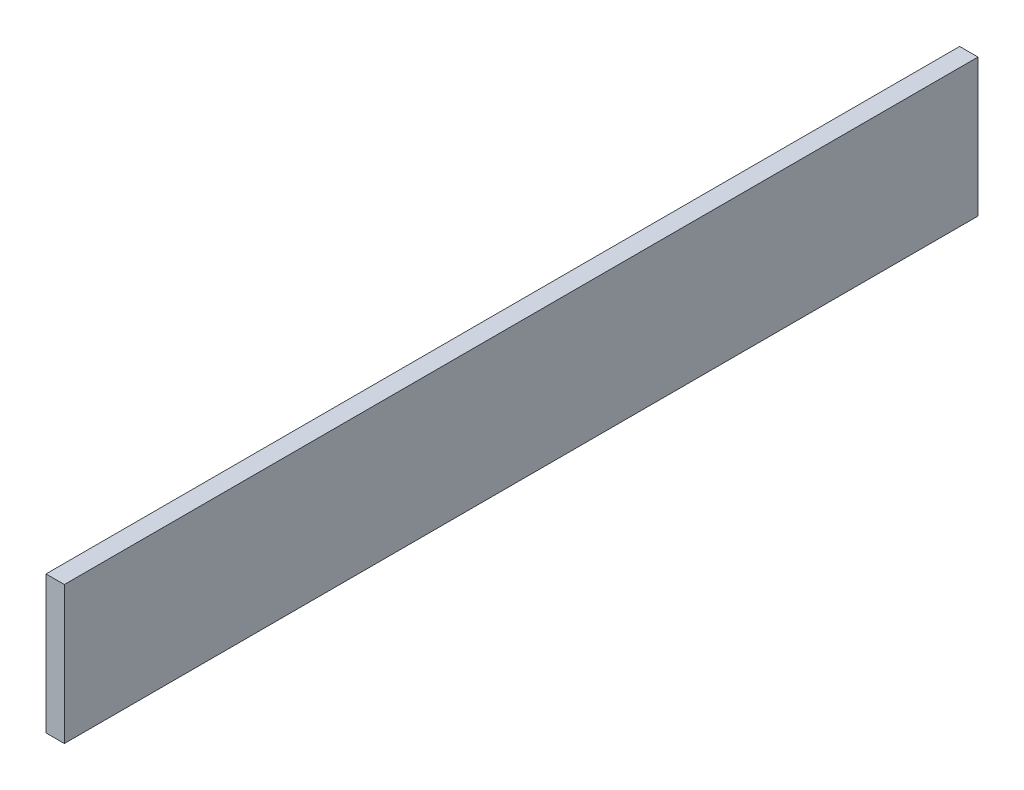
ISO-10303-21;
HEADER;
FILE_DESCRIPTION(('STEP AP214'),'2;1');
FILE_NAME('part.step','',(''),(''),'','','');
FILE_SCHEMA(('AUTOMOTIVE_DESIGN { 1 0 10303 214 1 1 1 1 }'));
ENDSEC;
DATA;
#1=APPLICATION_CONTEXT('core data for automotive mechanical design processes');
#2=APPLICATION_PROTOCOL_DEFINITION('international standard','automotive_design',2000,#1);
#3=PRODUCT_CONTEXT('',#1,'mechanical');
#4=PRODUCT('Part','Part','',(#3));
#5=PRODUCT_RELATED_PRODUCT_CATEGORY('part','',(#4));
#6=PRODUCT_DEFINITION_FORMATION('','',#4);
#7=PRODUCT_DEFINITION_CONTEXT('part definition',#1,'design');
#8=PRODUCT_DEFINITION('design','',#6,#7);
#9=PRODUCT_DEFINITION_SHAPE('','',#8);
#10=(LENGTH_UNIT() NAMED_UNIT(*) SI_UNIT(.MILLI.,.METRE.));
#11=(NAMED_UNIT(*) PLANE_ANGLE_UNIT() SI_UNIT($,.RADIAN.));
#12=(NAMED_UNIT(*) SI_UNIT($,.STERADIAN.) SOLID_ANGLE_UNIT());
#13=UNCERTAINTY_MEASURE_WITH_UNIT(LENGTH_MEASURE(1.E-05),#10,'distance_accuracy_value','');
#14=(GEOMETRIC_REPRESENTATION_CONTEXT(3) GLOBAL_UNCERTAINTY_ASSIGNED_CONTEXT((#13)) GLOBAL_UNIT_ASSIGNED_CONTEXT((#10,
#11,#12)) REPRESENTATION_CONTEXT('',''));
#15=CARTESIAN_POINT('',(0.,0.,0.));
#16=DIRECTION('',(0.,0.,1.));
#17=DIRECTION('',(1.,0.,0.));
#18=AXIS2_PLACEMENT_3D('',#15,#16,#17);
#19=CARTESIAN_POINT('',(4.,-30.,199.));
#20=DIRECTION('',(-1.,0.,0.));
#21=DIRECTION('',(0.,0.,1.));
#22=AXIS2_PLACEMENT_3D('',#19,#20,#21);
#23=PLANE('',#22);
#24=DIRECTION('',(0.,1.,0.));
#25=VECTOR('',#24,1.);
#26=CARTESIAN_POINT('',(4.,-30.,-199.));
#27=LINE('',#26,#25);
#28=CARTESIAN_POINT('',(4.,-30.,-199.));
#29=VERTEX_POINT('',#28);
#30=CARTESIAN_POINT('',(4.,30.,-199.));
#31=VERTEX_POINT('',#30);
#32=EDGE_CURVE('E96',#29,#31,#27,.T.);
#33=ORIENTED_EDGE('',*,*,#32,.T.);
#34=DIRECTION('',(0.,0.,-1.));
#35=VECTOR('',#34,1.);
#36=CARTESIAN_POINT('',(4.,30.,199.));
#37=LINE('',#36,#35);
#38=CARTESIAN_POINT('',(4.,30.,199.));
#39=VERTEX_POINT('',#38);
#40=EDGE_CURVE('E11',#39,#31,#37,.T.);
#41=ORIENTED_EDGE('',*,*,#40,.F.);
#42=DIRECTION('',(0.,1.,0.));
#43=VECTOR('',#42,1.);
#44=CARTESIAN_POINT('',(4.,-30.,199.));
#45=LINE('',#44,#43);
#46=CARTESIAN_POINT('',(4.,-30.,199.));
#47=VERTEX_POINT('',#46);
#48=EDGE_CURVE('E84',#47,#39,#45,.T.);
#49=ORIENTED_EDGE('',*,*,#48,.F.);
#50=DIRECTION('',(0.,0.,-1.));
#51=VECTOR('',#50,1.);
#52=CARTESIAN_POINT('',(4.,-30.,199.));
#53=LINE('',#52,#51);
#54=EDGE_CURVE('E92',#47,#29,#53,.T.);
#55=ORIENTED_EDGE('',*,*,#54,.T.);
#56=EDGE_LOOP('',(#33,#41,#49,#55));
#57=FACE_BOUND('',#56,.T.);
#58=ADVANCED_FACE('F33',(#57),#23,.F.);
#59=CARTESIAN_POINT('',(-4.,30.,199.));
#60=DIRECTION('',(0.,-1.,0.));
#61=DIRECTION('',(0.,0.,-1.));
#62=AXIS2_PLACEMENT_3D('',#59,#60,#61);
#63=PLANE('',#62);
#64=DIRECTION('',(-1.,0.,0.));
#65=VECTOR('',#64,1.);
#66=CARTESIAN_POINT('',(-4.,30.,-199.));
#67=LINE('',#66,#65);
#68=CARTESIAN_POINT('',(-4.,30.,-199.));
#69=VERTEX_POINT('',#68);
#70=EDGE_CURVE('E88',#31,#69,#67,.T.);
#71=ORIENTED_EDGE('',*,*,#70,.T.);
#72=DIRECTION('',(0.,0.,-1.));
#73=VECTOR('',#72,1.);
#74=CARTESIAN_POINT('',(-4.,30.,199.));
#75=LINE('',#74,#73);
#76=CARTESIAN_POINT('',(-4.,30.,199.));
#77=VERTEX_POINT('',#76);
#78=EDGE_CURVE('E41',#77,#69,#75,.T.);
#79=ORIENTED_EDGE('',*,*,#78,.F.);
#80=DIRECTION('',(-1.,0.,0.));
#81=VECTOR('',#80,1.);
#82=CARTESIAN_POINT('',(-4.,30.,199.));
#83=LINE('',#82,#81);
#84=EDGE_CURVE('E79',#39,#77,#83,.T.);
#85=ORIENTED_EDGE('',*,*,#84,.F.);
#86=ORIENTED_EDGE('',*,*,#40,.T.);
#87=EDGE_LOOP('',(#71,#79,#85,#86));
#88=FACE_BOUND('',#87,.T.);
#89=ADVANCED_FACE('F87',(#88),#63,.F.);
#90=CARTESIAN_POINT('',(-4.,-30.,199.));
#91=DIRECTION('',(1.,0.,0.));
#92=DIRECTION('',(0.,0.,-1.));
#93=AXIS2_PLACEMENT_3D('',#90,#91,#92);
#94=PLANE('',#93);
#95=DIRECTION('',(0.,-1.,0.));
#96=VECTOR('',#95,1.);
#97=CARTESIAN_POINT('',(-4.,-30.,-199.));
#98=LINE('',#97,#96);
#99=CARTESIAN_POINT('',(-4.,-30.,-199.));
#100=VERTEX_POINT('',#99);
#101=EDGE_CURVE('E66',#69,#100,#98,.T.);
#102=ORIENTED_EDGE('',*,*,#101,.T.);
#103=DIRECTION('',(0.,0.,-1.));
#104=VECTOR('',#103,1.);
#105=CARTESIAN_POINT('',(-4.,-30.,199.));
#106=LINE('',#105,#104);
#107=CARTESIAN_POINT('',(-4.,-30.,199.));
#108=VERTEX_POINT('',#107);
#109=EDGE_CURVE('E89',#108,#100,#106,.T.);
#110=ORIENTED_EDGE('',*,*,#109,.F.);
#111=DIRECTION('',(0.,-1.,0.));
#112=VECTOR('',#111,1.);
#113=CARTESIAN_POINT('',(-4.,-30.,199.));
#114=LINE('',#113,#112);
#115=EDGE_CURVE('E82',#77,#108,#114,.T.);
#116=ORIENTED_EDGE('',*,*,#115,.F.);
#117=ORIENTED_EDGE('',*,*,#78,.T.);
#118=EDGE_LOOP('',(#102,#110,#116,#117));
#119=FACE_BOUND('',#118,.T.);
#120=ADVANCED_FACE('F90',(#119),#94,.F.);
#121=CARTESIAN_POINT('',(-4.,-30.,199.));
#122=DIRECTION('',(0.,1.,0.));
#123=DIRECTION('',(0.,0.,1.));
#124=AXIS2_PLACEMENT_3D('',#121,#122,#123);
#125=PLANE('',#124);
#126=DIRECTION('',(1.,0.,0.));
#127=VECTOR('',#126,1.);
#128=CARTESIAN_POINT('',(-4.,-30.,-199.));
#129=LINE('',#128,#127);
#130=EDGE_CURVE('E72',#100,#29,#129,.T.);
#131=ORIENTED_EDGE('',*,*,#130,.T.);
#132=ORIENTED_EDGE('',*,*,#54,.F.);
#133=DIRECTION('',(1.,0.,0.));
#134=VECTOR('',#133,1.);
#135=CARTESIAN_POINT('',(-4.,-30.,199.));
#136=LINE('',#135,#134);
#137=EDGE_CURVE('E49',#108,#47,#136,.T.);
#138=ORIENTED_EDGE('',*,*,#137,.F.);
#139=ORIENTED_EDGE('',*,*,#109,.T.);
#140=EDGE_LOOP('',(#131,#132,#138,#139));
#141=FACE_BOUND('',#140,.T.);
#142=ADVANCED_FACE('F103',(#141),#125,.F.);
#143=CARTESIAN_POINT('',(0.,0.,199.));
#144=DIRECTION('',(0.,0.,-1.));
#145=DIRECTION('',(-1.,0.,0.));
#146=AXIS2_PLACEMENT_3D('',#143,#144,#145);
#147=PLANE('',#146);
#148=ORIENTED_EDGE('',*,*,#48,.T.);
#149=ORIENTED_EDGE('',*,*,#84,.T.);
#150=ORIENTED_EDGE('',*,*,#115,.T.);
#151=ORIENTED_EDGE('',*,*,#137,.T.);
#152=EDGE_LOOP('',(#148,#149,#150,#151));
#153=FACE_BOUND('',#152,.T.);
#154=ADVANCED_FACE('F80',(#153),#147,.F.);
#155=CARTESIAN_POINT('',(0.,0.,-199.));
#156=DIRECTION('',(0.,0.,-1.));
#157=DIRECTION('',(-1.,0.,0.));
#158=AXIS2_PLACEMENT_3D('',#155,#156,#157);
#159=PLANE('',#158);
#160=ORIENTED_EDGE('',*,*,#32,.F.);
#161=ORIENTED_EDGE('',*,*,#130,.F.);
#162=ORIENTED_EDGE('',*,*,#101,.F.);
#163=ORIENTED_EDGE('',*,*,#70,.F.);
#164=EDGE_LOOP('',(#160,#161,#162,#163));
#165=FACE_BOUND('',#164,.T.);
#166=ADVANCED_FACE('F106',(#165),#159,.T.);
#167=CLOSED_SHELL('',(#58,#89,#120,#142,#154,#166));
#168=MANIFOLD_SOLID_BREP('B2',#167);
#169=ADVANCED_BREP_SHAPE_REPRESENTATION('',(#18,#168),#14);
#170=SHAPE_DEFINITION_REPRESENTATION(#9,#169);
ENDSEC;
END-ISO-10303-21;
